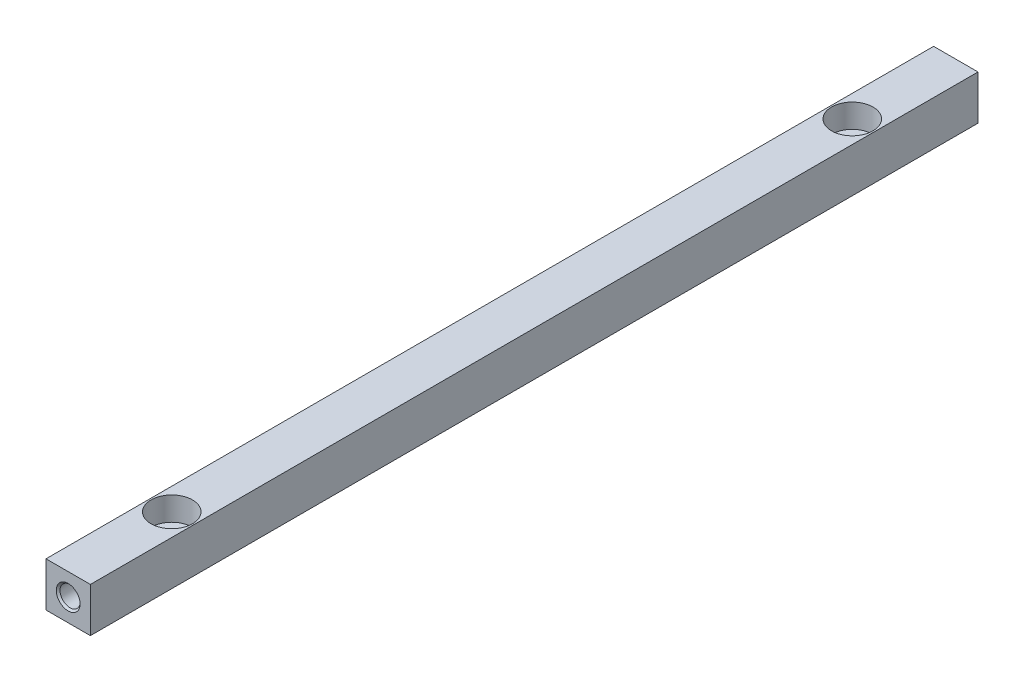
ISO-10303-21;
HEADER;
FILE_DESCRIPTION(('STEP AP214'),'2;1');
FILE_NAME('part.step','',(''),(''),'','','');
FILE_SCHEMA(('AUTOMOTIVE_DESIGN { 1 0 10303 214 1 1 1 1 }'));
ENDSEC;
DATA;
#1=APPLICATION_CONTEXT('core data for automotive mechanical design processes');
#2=APPLICATION_PROTOCOL_DEFINITION('international standard','automotive_design',2000,#1);
#3=PRODUCT_CONTEXT('',#1,'mechanical');
#4=PRODUCT('Part','Part','',(#3));
#5=PRODUCT_RELATED_PRODUCT_CATEGORY('part','',(#4));
#6=PRODUCT_DEFINITION_FORMATION('','',#4);
#7=PRODUCT_DEFINITION_CONTEXT('part definition',#1,'design');
#8=PRODUCT_DEFINITION('design','',#6,#7);
#9=PRODUCT_DEFINITION_SHAPE('','',#8);
#10=(LENGTH_UNIT() NAMED_UNIT(*) SI_UNIT(.MILLI.,.METRE.));
#11=(NAMED_UNIT(*) PLANE_ANGLE_UNIT() SI_UNIT($,.RADIAN.));
#12=(NAMED_UNIT(*) SI_UNIT($,.STERADIAN.) SOLID_ANGLE_UNIT());
#13=UNCERTAINTY_MEASURE_WITH_UNIT(LENGTH_MEASURE(1.E-05),#10,'distance_accuracy_value','');
#14=(GEOMETRIC_REPRESENTATION_CONTEXT(3) GLOBAL_UNCERTAINTY_ASSIGNED_CONTEXT((#13)) GLOBAL_UNIT_ASSIGNED_CONTEXT((#10,
#11,#12)) REPRESENTATION_CONTEXT('',''));
#15=CARTESIAN_POINT('',(0.,0.,0.));
#16=DIRECTION('',(0.,0.,1.));
#17=DIRECTION('',(1.,0.,0.));
#18=AXIS2_PLACEMENT_3D('',#15,#16,#17);
#19=CARTESIAN_POINT('',(-7.5,7.5,150.));
#20=DIRECTION('',(0.,-1.,0.));
#21=DIRECTION('',(0.,0.,-1.));
#22=AXIS2_PLACEMENT_3D('',#19,#20,#21);
#23=PLANE('',#22);
#24=CARTESIAN_POINT('',(0.,7.5,-115.));
#25=DIRECTION('',(0.,1.,0.));
#26=DIRECTION('',(0.,0.,1.));
#27=AXIS2_PLACEMENT_3D('',#24,#25,#26);
#28=CIRCLE('',#27,7.00000000000001);
#29=CARTESIAN_POINT('',(0.,7.5,-108.));
#30=VERTEX_POINT('',#29);
#31=EDGE_CURVE('E171',#30,#30,#28,.T.);
#32=ORIENTED_EDGE('',*,*,#31,.F.);
#33=EDGE_LOOP('',(#32));
#34=FACE_BOUND('',#33,.T.);
#35=DIRECTION('',(-1.,0.,0.));
#36=VECTOR('',#35,1.);
#37=CARTESIAN_POINT('',(-7.5,7.5,-150.));
#38=LINE('',#37,#36);
#39=CARTESIAN_POINT('',(7.5,7.5,-150.));
#40=VERTEX_POINT('',#39);
#41=CARTESIAN_POINT('',(-7.5,7.5,-150.));
#42=VERTEX_POINT('',#41);
#43=EDGE_CURVE('E133',#40,#42,#38,.T.);
#44=ORIENTED_EDGE('',*,*,#43,.T.);
#45=DIRECTION('',(0.,0.,-1.));
#46=VECTOR('',#45,1.);
#47=CARTESIAN_POINT('',(-7.5,7.5,150.));
#48=LINE('',#47,#46);
#49=CARTESIAN_POINT('',(-7.5,7.5,150.));
#50=VERTEX_POINT('',#49);
#51=EDGE_CURVE('E51',#50,#42,#48,.T.);
#52=ORIENTED_EDGE('',*,*,#51,.F.);
#53=DIRECTION('',(-1.,0.,0.));
#54=VECTOR('',#53,1.);
#55=CARTESIAN_POINT('',(-7.5,7.5,150.));
#56=LINE('',#55,#54);
#57=CARTESIAN_POINT('',(7.5,7.5,150.));
#58=VERTEX_POINT('',#57);
#59=EDGE_CURVE('E90',#58,#50,#56,.T.);
#60=ORIENTED_EDGE('',*,*,#59,.F.);
#61=DIRECTION('',(0.,0.,-1.));
#62=VECTOR('',#61,1.);
#63=CARTESIAN_POINT('',(7.5,7.5,150.));
#64=LINE('',#63,#62);
#65=EDGE_CURVE('E11',#58,#40,#64,.T.);
#66=ORIENTED_EDGE('',*,*,#65,.T.);
#67=EDGE_LOOP('',(#44,#52,#60,#66));
#68=FACE_BOUND('',#67,.T.);
#69=CARTESIAN_POINT('',(0.,7.5,115.));
#70=DIRECTION('',(0.,1.,0.));
#71=DIRECTION('',(0.,0.,1.));
#72=AXIS2_PLACEMENT_3D('',#69,#70,#71);
#73=CIRCLE('',#72,7.00000000000001);
#74=CARTESIAN_POINT('',(0.,7.5,122.));
#75=VERTEX_POINT('',#74);
#76=EDGE_CURVE('E175',#75,#75,#73,.T.);
#77=ORIENTED_EDGE('',*,*,#76,.F.);
#78=EDGE_LOOP('',(#77));
#79=FACE_BOUND('',#78,.T.);
#80=ADVANCED_FACE('F42',(#34,#68,#79),#23,.F.);
#81=CARTESIAN_POINT('',(7.5,-7.5,150.));
#82=DIRECTION('',(-1.,0.,0.));
#83=DIRECTION('',(0.,0.,1.));
#84=AXIS2_PLACEMENT_3D('',#81,#82,#83);
#85=PLANE('',#84);
#86=DIRECTION('',(0.,1.,0.));
#87=VECTOR('',#86,1.);
#88=CARTESIAN_POINT('',(7.5,-7.5,-150.));
#89=LINE('',#88,#87);
#90=CARTESIAN_POINT('',(7.5,-7.5,-150.));
#91=VERTEX_POINT('',#90);
#92=EDGE_CURVE('E123',#91,#40,#89,.T.);
#93=ORIENTED_EDGE('',*,*,#92,.T.);
#94=ORIENTED_EDGE('',*,*,#65,.F.);
#95=DIRECTION('',(0.,1.,0.));
#96=VECTOR('',#95,1.);
#97=CARTESIAN_POINT('',(7.5,-7.5,150.));
#98=LINE('',#97,#96);
#99=CARTESIAN_POINT('',(7.5,-7.5,150.));
#100=VERTEX_POINT('',#99);
#101=EDGE_CURVE('E124',#100,#58,#98,.T.);
#102=ORIENTED_EDGE('',*,*,#101,.F.);
#103=DIRECTION('',(0.,0.,-1.));
#104=VECTOR('',#103,1.);
#105=CARTESIAN_POINT('',(7.5,-7.5,150.));
#106=LINE('',#105,#104);
#107=EDGE_CURVE('E130',#100,#91,#106,.T.);
#108=ORIENTED_EDGE('',*,*,#107,.T.);
#109=EDGE_LOOP('',(#93,#94,#102,#108));
#110=FACE_BOUND('',#109,.T.);
#111=ADVANCED_FACE('F44',(#110),#85,.F.);
#112=CARTESIAN_POINT('',(-7.5,-7.5,150.));
#113=DIRECTION('',(1.,0.,0.));
#114=DIRECTION('',(0.,0.,-1.));
#115=AXIS2_PLACEMENT_3D('',#112,#113,#114);
#116=PLANE('',#115);
#117=DIRECTION('',(0.,-1.,0.));
#118=VECTOR('',#117,1.);
#119=CARTESIAN_POINT('',(-7.5,-7.5,-150.));
#120=LINE('',#119,#118);
#121=CARTESIAN_POINT('',(-7.5,-7.5,-150.));
#122=VERTEX_POINT('',#121);
#123=EDGE_CURVE('E77',#42,#122,#120,.T.);
#124=ORIENTED_EDGE('',*,*,#123,.T.);
#125=DIRECTION('',(0.,0.,-1.));
#126=VECTOR('',#125,1.);
#127=CARTESIAN_POINT('',(-7.5,-7.5,150.));
#128=LINE('',#127,#126);
#129=CARTESIAN_POINT('',(-7.5,-7.5,150.));
#130=VERTEX_POINT('',#129);
#131=EDGE_CURVE('E138',#130,#122,#128,.T.);
#132=ORIENTED_EDGE('',*,*,#131,.F.);
#133=DIRECTION('',(0.,-1.,0.));
#134=VECTOR('',#133,1.);
#135=CARTESIAN_POINT('',(-7.5,-7.5,150.));
#136=LINE('',#135,#134);
#137=EDGE_CURVE('E127',#50,#130,#136,.T.);
#138=ORIENTED_EDGE('',*,*,#137,.F.);
#139=ORIENTED_EDGE('',*,*,#51,.T.);
#140=EDGE_LOOP('',(#124,#132,#138,#139));
#141=FACE_BOUND('',#140,.T.);
#142=ADVANCED_FACE('F140',(#141),#116,.F.);
#143=CARTESIAN_POINT('',(-7.5,-7.5,150.));
#144=DIRECTION('',(0.,1.,0.));
#145=DIRECTION('',(0.,0.,1.));
#146=AXIS2_PLACEMENT_3D('',#143,#144,#145);
#147=PLANE('',#146);
#148=CARTESIAN_POINT('',(0.,-7.5,115.));
#149=DIRECTION('',(0.,1.,0.));
#150=DIRECTION('',(0.,0.,1.));
#151=AXIS2_PLACEMENT_3D('',#148,#149,#150);
#152=CIRCLE('',#151,4.25000000000001);
#153=CARTESIAN_POINT('',(0.,-7.5,119.25));
#154=VERTEX_POINT('',#153);
#155=EDGE_CURVE('E185',#154,#154,#152,.T.);
#156=ORIENTED_EDGE('',*,*,#155,.T.);
#157=EDGE_LOOP('',(#156));
#158=FACE_BOUND('',#157,.T.);
#159=CARTESIAN_POINT('',(0.,-7.5,-115.));
#160=DIRECTION('',(0.,1.,0.));
#161=DIRECTION('',(0.,0.,1.));
#162=AXIS2_PLACEMENT_3D('',#159,#160,#161);
#163=CIRCLE('',#162,4.25000000000001);
#164=CARTESIAN_POINT('',(0.,-7.5,-110.75));
#165=VERTEX_POINT('',#164);
#166=EDGE_CURVE('E194',#165,#165,#163,.T.);
#167=ORIENTED_EDGE('',*,*,#166,.T.);
#168=EDGE_LOOP('',(#167));
#169=FACE_BOUND('',#168,.T.);
#170=DIRECTION('',(1.,0.,0.));
#171=VECTOR('',#170,1.);
#172=CARTESIAN_POINT('',(-7.5,-7.5,-150.));
#173=LINE('',#172,#171);
#174=EDGE_CURVE('E83',#122,#91,#173,.T.);
#175=ORIENTED_EDGE('',*,*,#174,.T.);
#176=ORIENTED_EDGE('',*,*,#107,.F.);
#177=DIRECTION('',(1.,0.,0.));
#178=VECTOR('',#177,1.);
#179=CARTESIAN_POINT('',(-7.5,-7.5,150.));
#180=LINE('',#179,#178);
#181=EDGE_CURVE('E59',#130,#100,#180,.T.);
#182=ORIENTED_EDGE('',*,*,#181,.F.);
#183=ORIENTED_EDGE('',*,*,#131,.T.);
#184=EDGE_LOOP('',(#175,#176,#182,#183));
#185=FACE_BOUND('',#184,.T.);
#186=ADVANCED_FACE('F147',(#158,#169,#185),#147,.F.);
#187=CARTESIAN_POINT('',(0.,0.,150.));
#188=DIRECTION('',(0.,0.,-1.));
#189=DIRECTION('',(-1.,0.,0.));
#190=AXIS2_PLACEMENT_3D('',#187,#188,#189);
#191=PLANE('',#190);
#192=CARTESIAN_POINT('',(0.,0.,150.));
#193=DIRECTION('',(0.,0.,1.));
#194=DIRECTION('',(1.,0.,0.));
#195=AXIS2_PLACEMENT_3D('',#192,#193,#194);
#196=CIRCLE('',#195,4.025);
#197=CARTESIAN_POINT('',(4.025,0.,150.));
#198=VERTEX_POINT('',#197);
#199=EDGE_CURVE('E107',#198,#198,#196,.T.);
#200=ORIENTED_EDGE('',*,*,#199,.F.);
#201=EDGE_LOOP('',(#200));
#202=FACE_BOUND('',#201,.T.);
#203=ORIENTED_EDGE('',*,*,#101,.T.);
#204=ORIENTED_EDGE('',*,*,#59,.T.);
#205=ORIENTED_EDGE('',*,*,#137,.T.);
#206=ORIENTED_EDGE('',*,*,#181,.T.);
#207=EDGE_LOOP('',(#203,#204,#205,#206));
#208=FACE_BOUND('',#207,.T.);
#209=ADVANCED_FACE('F149',(#202,#208),#191,.F.);
#210=CARTESIAN_POINT('',(0.,0.,-150.));
#211=DIRECTION('',(0.,0.,-1.));
#212=DIRECTION('',(-1.,0.,0.));
#213=AXIS2_PLACEMENT_3D('',#210,#211,#212);
#214=PLANE('',#213);
#215=CARTESIAN_POINT('',(0.,0.,-150.));
#216=DIRECTION('',(0.,0.,-1.));
#217=DIRECTION('',(-1.,0.,0.));
#218=AXIS2_PLACEMENT_3D('',#215,#216,#217);
#219=CIRCLE('',#218,4.025);
#220=CARTESIAN_POINT('',(-4.025,0.,-150.));
#221=VERTEX_POINT('',#220);
#222=EDGE_CURVE('E114',#221,#221,#219,.T.);
#223=ORIENTED_EDGE('',*,*,#222,.F.);
#224=EDGE_LOOP('',(#223));
#225=FACE_BOUND('',#224,.T.);
#226=ORIENTED_EDGE('',*,*,#92,.F.);
#227=ORIENTED_EDGE('',*,*,#174,.F.);
#228=ORIENTED_EDGE('',*,*,#123,.F.);
#229=ORIENTED_EDGE('',*,*,#43,.F.);
#230=EDGE_LOOP('',(#226,#227,#228,#229));
#231=FACE_BOUND('',#230,.T.);
#232=ADVANCED_FACE('F143',(#225,#231),#214,.T.);
#233=CARTESIAN_POINT('',(0.,0.,127.75));
#234=DIRECTION('',(0.,0.,1.));
#235=DIRECTION('',(1.,0.,0.));
#236=AXIS2_PLACEMENT_3D('',#233,#234,#235);
#237=CONICAL_SURFACE('',#236,3.39999999999998,1.02974425867665);
#238=CARTESIAN_POINT('',(0.,0.,125.707073895306));
#239=VERTEX_POINT('',#238);
#240=VERTEX_LOOP('',#239);
#241=FACE_BOUND('',#240,.T.);
#242=CARTESIAN_POINT('',(0.,0.,127.75));
#243=DIRECTION('',(0.,0.,1.));
#244=DIRECTION('',(1.,0.,0.));
#245=AXIS2_PLACEMENT_3D('',#242,#243,#244);
#246=CIRCLE('',#245,3.39999999999998);
#247=CARTESIAN_POINT('',(3.39999999999998,0.,127.75));
#248=VERTEX_POINT('',#247);
#249=EDGE_CURVE('E120',#248,#248,#246,.T.);
#250=ORIENTED_EDGE('',*,*,#249,.T.);
#251=EDGE_LOOP('',(#250));
#252=FACE_BOUND('',#251,.T.);
#253=ADVANCED_FACE('F202',(#241,#252),#237,.F.);
#254=CARTESIAN_POINT('',(0.,0.,150.));
#255=DIRECTION('',(0.,0.,1.));
#256=DIRECTION('',(1.,0.,0.));
#257=AXIS2_PLACEMENT_3D('',#254,#255,#256);
#258=CYLINDRICAL_SURFACE('',#257,3.39999999999999);
#259=ORIENTED_EDGE('',*,*,#249,.F.);
#260=EDGE_LOOP('',(#259));
#261=FACE_BOUND('',#260,.T.);
#262=CARTESIAN_POINT('',(0.,0.,149.375));
#263=DIRECTION('',(0.,0.,1.));
#264=DIRECTION('',(1.,0.,0.));
#265=AXIS2_PLACEMENT_3D('',#262,#263,#264);
#266=CIRCLE('',#265,3.4);
#267=CARTESIAN_POINT('',(3.4,0.,149.375));
#268=VERTEX_POINT('',#267);
#269=EDGE_CURVE('E111',#268,#268,#266,.T.);
#270=ORIENTED_EDGE('',*,*,#269,.T.);
#271=EDGE_LOOP('',(#270));
#272=FACE_BOUND('',#271,.T.);
#273=ADVANCED_FACE('F208',(#261,#272),#258,.F.);
#274=CARTESIAN_POINT('',(0.,0.,150.));
#275=DIRECTION('',(0.,0.,1.));
#276=DIRECTION('',(1.,0.,0.));
#277=AXIS2_PLACEMENT_3D('',#274,#275,#276);
#278=CONICAL_SURFACE('',#277,4.025,0.78539816339744);
#279=ORIENTED_EDGE('',*,*,#269,.F.);
#280=EDGE_LOOP('',(#279));
#281=FACE_BOUND('',#280,.T.);
#282=ORIENTED_EDGE('',*,*,#199,.T.);
#283=EDGE_LOOP('',(#282));
#284=FACE_BOUND('',#283,.T.);
#285=ADVANCED_FACE('F101',(#281,#284),#278,.F.);
#286=CARTESIAN_POINT('',(0.,0.,-127.75));
#287=DIRECTION('',(0.,0.,-1.));
#288=DIRECTION('',(-1.,0.,0.));
#289=AXIS2_PLACEMENT_3D('',#286,#287,#288);
#290=CONICAL_SURFACE('',#289,3.39999999999998,1.02974425867665);
#291=CARTESIAN_POINT('',(0.,0.,-125.707073895306));
#292=VERTEX_POINT('',#291);
#293=VERTEX_LOOP('',#292);
#294=FACE_BOUND('',#293,.T.);
#295=CARTESIAN_POINT('',(0.,0.,-127.75));
#296=DIRECTION('',(0.,0.,-1.));
#297=DIRECTION('',(-1.,0.,0.));
#298=AXIS2_PLACEMENT_3D('',#295,#296,#297);
#299=CIRCLE('',#298,3.39999999999998);
#300=CARTESIAN_POINT('',(-3.39999999999998,0.,-127.75));
#301=VERTEX_POINT('',#300);
#302=EDGE_CURVE('E105',#301,#301,#299,.T.);
#303=ORIENTED_EDGE('',*,*,#302,.T.);
#304=EDGE_LOOP('',(#303));
#305=FACE_BOUND('',#304,.T.);
#306=ADVANCED_FACE('F97',(#294,#305),#290,.F.);
#307=CARTESIAN_POINT('',(0.,0.,-150.));
#308=DIRECTION('',(0.,0.,-1.));
#309=DIRECTION('',(-1.,0.,0.));
#310=AXIS2_PLACEMENT_3D('',#307,#308,#309);
#311=CYLINDRICAL_SURFACE('',#310,3.39999999999999);
#312=ORIENTED_EDGE('',*,*,#302,.F.);
#313=EDGE_LOOP('',(#312));
#314=FACE_BOUND('',#313,.T.);
#315=CARTESIAN_POINT('',(0.,0.,-149.375));
#316=DIRECTION('',(0.,0.,-1.));
#317=DIRECTION('',(-1.,0.,0.));
#318=AXIS2_PLACEMENT_3D('',#315,#316,#317);
#319=CIRCLE('',#318,3.4);
#320=CARTESIAN_POINT('',(-3.4,0.,-149.375));
#321=VERTEX_POINT('',#320);
#322=EDGE_CURVE('E108',#321,#321,#319,.T.);
#323=ORIENTED_EDGE('',*,*,#322,.T.);
#324=EDGE_LOOP('',(#323));
#325=FACE_BOUND('',#324,.T.);
#326=ADVANCED_FACE('F100',(#314,#325),#311,.F.);
#327=CARTESIAN_POINT('',(0.,0.,-150.));
#328=DIRECTION('',(0.,0.,-1.));
#329=DIRECTION('',(-1.,0.,0.));
#330=AXIS2_PLACEMENT_3D('',#327,#328,#329);
#331=CONICAL_SURFACE('',#330,4.025,0.78539816339744);
#332=ORIENTED_EDGE('',*,*,#322,.F.);
#333=EDGE_LOOP('',(#332));
#334=FACE_BOUND('',#333,.T.);
#335=ORIENTED_EDGE('',*,*,#222,.T.);
#336=EDGE_LOOP('',(#335));
#337=FACE_BOUND('',#336,.T.);
#338=ADVANCED_FACE('F199',(#334,#337),#331,.F.);
#339=CARTESIAN_POINT('',(0.,7.5,-115.));
#340=DIRECTION('',(0.,1.,0.));
#341=DIRECTION('',(0.,0.,1.));
#342=AXIS2_PLACEMENT_3D('',#339,#340,#341);
#343=CYLINDRICAL_SURFACE('',#342,4.25000000000001);
#344=ORIENTED_EDGE('',*,*,#166,.F.);
#345=EDGE_LOOP('',(#344));
#346=FACE_BOUND('',#345,.T.);
#347=CARTESIAN_POINT('',(0.,-0.499999999999999,-115.));
#348=DIRECTION('',(0.,1.,0.));
#349=DIRECTION('',(0.,0.,1.));
#350=AXIS2_PLACEMENT_3D('',#347,#348,#349);
#351=CIRCLE('',#350,4.25000000000001);
#352=CARTESIAN_POINT('',(0.,-0.499999999999999,-110.75));
#353=VERTEX_POINT('',#352);
#354=EDGE_CURVE('E191',#353,#353,#351,.T.);
#355=ORIENTED_EDGE('',*,*,#354,.T.);
#356=EDGE_LOOP('',(#355));
#357=FACE_BOUND('',#356,.T.);
#358=ADVANCED_FACE('F222',(#346,#357),#343,.F.);
#359=CARTESIAN_POINT('',(4.25000000000001,-0.499999999999999,-115.));
#360=DIRECTION('',(0.,-1.,0.));
#361=DIRECTION('',(0.,0.,-1.));
#362=AXIS2_PLACEMENT_3D('',#359,#360,#361);
#363=PLANE('',#362);
#364=ORIENTED_EDGE('',*,*,#354,.F.);
#365=EDGE_LOOP('',(#364));
#366=FACE_BOUND('',#365,.T.);
#367=CARTESIAN_POINT('',(0.,-0.499999999999999,-115.));
#368=DIRECTION('',(0.,1.,0.));
#369=DIRECTION('',(0.,0.,1.));
#370=AXIS2_PLACEMENT_3D('',#367,#368,#369);
#371=CIRCLE('',#370,7.00000000000001);
#372=CARTESIAN_POINT('',(0.,-0.499999999999999,-108.));
#373=VERTEX_POINT('',#372);
#374=EDGE_CURVE('E188',#373,#373,#371,.T.);
#375=ORIENTED_EDGE('',*,*,#374,.T.);
#376=EDGE_LOOP('',(#375));
#377=FACE_BOUND('',#376,.T.);
#378=ADVANCED_FACE('F226',(#366,#377),#363,.F.);
#379=CARTESIAN_POINT('',(0.,7.5,-115.));
#380=DIRECTION('',(0.,1.,0.));
#381=DIRECTION('',(0.,0.,1.));
#382=AXIS2_PLACEMENT_3D('',#379,#380,#381);
#383=CYLINDRICAL_SURFACE('',#382,7.00000000000001);
#384=ORIENTED_EDGE('',*,*,#374,.F.);
#385=EDGE_LOOP('',(#384));
#386=FACE_BOUND('',#385,.T.);
#387=ORIENTED_EDGE('',*,*,#31,.T.);
#388=EDGE_LOOP('',(#387));
#389=FACE_BOUND('',#388,.T.);
#390=ADVANCED_FACE('F230',(#386,#389),#383,.F.);
#391=CARTESIAN_POINT('',(0.,7.5,115.));
#392=DIRECTION('',(0.,1.,0.));
#393=DIRECTION('',(0.,0.,1.));
#394=AXIS2_PLACEMENT_3D('',#391,#392,#393);
#395=CYLINDRICAL_SURFACE('',#394,4.25000000000001);
#396=ORIENTED_EDGE('',*,*,#155,.F.);
#397=EDGE_LOOP('',(#396));
#398=FACE_BOUND('',#397,.T.);
#399=CARTESIAN_POINT('',(0.,-0.499999999999999,115.));
#400=DIRECTION('',(0.,1.,0.));
#401=DIRECTION('',(0.,0.,1.));
#402=AXIS2_PLACEMENT_3D('',#399,#400,#401);
#403=CIRCLE('',#402,4.25000000000001);
#404=CARTESIAN_POINT('',(0.,-0.499999999999999,119.25));
#405=VERTEX_POINT('',#404);
#406=EDGE_CURVE('E180',#405,#405,#403,.T.);
#407=ORIENTED_EDGE('',*,*,#406,.T.);
#408=EDGE_LOOP('',(#407));
#409=FACE_BOUND('',#408,.T.);
#410=ADVANCED_FACE('F234',(#398,#409),#395,.F.);
#411=CARTESIAN_POINT('',(4.25000000000001,-0.499999999999999,115.));
#412=DIRECTION('',(0.,-1.,0.));
#413=DIRECTION('',(0.,0.,-1.));
#414=AXIS2_PLACEMENT_3D('',#411,#412,#413);
#415=PLANE('',#414);
#416=ORIENTED_EDGE('',*,*,#406,.F.);
#417=EDGE_LOOP('',(#416));
#418=FACE_BOUND('',#417,.T.);
#419=CARTESIAN_POINT('',(0.,-0.499999999999999,115.));
#420=DIRECTION('',(0.,1.,0.));
#421=DIRECTION('',(0.,0.,1.));
#422=AXIS2_PLACEMENT_3D('',#419,#420,#421);
#423=CIRCLE('',#422,7.00000000000001);
#424=CARTESIAN_POINT('',(0.,-0.499999999999999,122.));
#425=VERTEX_POINT('',#424);
#426=EDGE_CURVE('E177',#425,#425,#423,.T.);
#427=ORIENTED_EDGE('',*,*,#426,.T.);
#428=EDGE_LOOP('',(#427));
#429=FACE_BOUND('',#428,.T.);
#430=ADVANCED_FACE('F238',(#418,#429),#415,.F.);
#431=CARTESIAN_POINT('',(0.,7.5,115.));
#432=DIRECTION('',(0.,1.,0.));
#433=DIRECTION('',(0.,0.,1.));
#434=AXIS2_PLACEMENT_3D('',#431,#432,#433);
#435=CYLINDRICAL_SURFACE('',#434,7.00000000000001);
#436=ORIENTED_EDGE('',*,*,#426,.F.);
#437=EDGE_LOOP('',(#436));
#438=FACE_BOUND('',#437,.T.);
#439=ORIENTED_EDGE('',*,*,#76,.T.);
#440=EDGE_LOOP('',(#439));
#441=FACE_BOUND('',#440,.T.);
#442=ADVANCED_FACE('F242',(#438,#441),#435,.F.);
#443=CLOSED_SHELL('',(#80,#111,#142,#186,#209,#232,#253,#273,#285,#306,#326,#338,#358,#378,#390,
#410,#430,#442));
#444=MANIFOLD_SOLID_BREP('B2',#443);
#445=ADVANCED_BREP_SHAPE_REPRESENTATION('',(#18,#444),#14);
#446=SHAPE_DEFINITION_REPRESENTATION(#9,#445);
ENDSEC;
END-ISO-10303-21;
